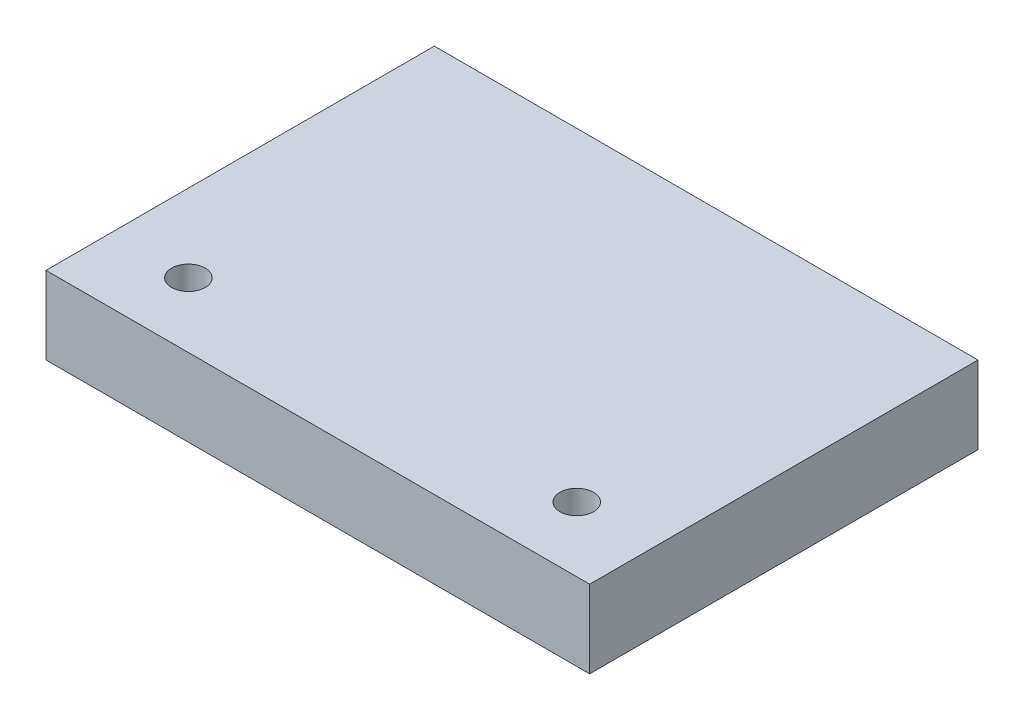
ISO-10303-21;
HEADER;
FILE_DESCRIPTION(('STEP AP214'),'2;1');
FILE_NAME('part.step','',(''),(''),'','','');
FILE_SCHEMA(('AUTOMOTIVE_DESIGN { 1 0 10303 214 1 1 1 1 }'));
ENDSEC;
DATA;
#1=APPLICATION_CONTEXT('core data for automotive mechanical design processes');
#2=APPLICATION_PROTOCOL_DEFINITION('international standard','automotive_design',2000,#1);
#3=PRODUCT_CONTEXT('',#1,'mechanical');
#4=PRODUCT('Part','Part','',(#3));
#5=PRODUCT_RELATED_PRODUCT_CATEGORY('part','',(#4));
#6=PRODUCT_DEFINITION_FORMATION('','',#4);
#7=PRODUCT_DEFINITION_CONTEXT('part definition',#1,'design');
#8=PRODUCT_DEFINITION('design','',#6,#7);
#9=PRODUCT_DEFINITION_SHAPE('','',#8);
#10=(LENGTH_UNIT() NAMED_UNIT(*) SI_UNIT(.MILLI.,.METRE.));
#11=(NAMED_UNIT(*) PLANE_ANGLE_UNIT() SI_UNIT($,.RADIAN.));
#12=(NAMED_UNIT(*) SI_UNIT($,.STERADIAN.) SOLID_ANGLE_UNIT());
#13=UNCERTAINTY_MEASURE_WITH_UNIT(LENGTH_MEASURE(1.E-05),#10,'distance_accuracy_value','');
#14=(GEOMETRIC_REPRESENTATION_CONTEXT(3) GLOBAL_UNCERTAINTY_ASSIGNED_CONTEXT((#13)) GLOBAL_UNIT_ASSIGNED_CONTEXT((#10,
#11,#12)) REPRESENTATION_CONTEXT('',''));
#15=CARTESIAN_POINT('',(0.,0.,0.));
#16=DIRECTION('',(0.,0.,1.));
#17=DIRECTION('',(1.,0.,0.));
#18=AXIS2_PLACEMENT_3D('',#15,#16,#17);
#19=CARTESIAN_POINT('',(10.5,3.,-7.5));
#20=DIRECTION('',(-1.,0.,0.));
#21=DIRECTION('',(0.,0.,1.));
#22=AXIS2_PLACEMENT_3D('',#19,#20,#21);
#23=PLANE('',#22);
#24=DIRECTION('',(0.,0.,-1.));
#25=VECTOR('',#24,1.);
#26=CARTESIAN_POINT('',(10.5,0.,-7.5));
#27=LINE('',#26,#25);
#28=CARTESIAN_POINT('',(10.5,0.,7.5));
#29=VERTEX_POINT('',#28);
#30=CARTESIAN_POINT('',(10.5,0.,-7.5));
#31=VERTEX_POINT('',#30);
#32=EDGE_CURVE('E102',#29,#31,#27,.T.);
#33=ORIENTED_EDGE('',*,*,#32,.T.);
#34=DIRECTION('',(0.,-1.,0.));
#35=VECTOR('',#34,1.);
#36=CARTESIAN_POINT('',(10.5,3.,-7.5));
#37=LINE('',#36,#35);
#38=CARTESIAN_POINT('',(10.5,3.,-7.5));
#39=VERTEX_POINT('',#38);
#40=EDGE_CURVE('E11',#39,#31,#37,.T.);
#41=ORIENTED_EDGE('',*,*,#40,.F.);
#42=DIRECTION('',(0.,0.,-1.));
#43=VECTOR('',#42,1.);
#44=CARTESIAN_POINT('',(10.5,3.,-7.5));
#45=LINE('',#44,#43);
#46=CARTESIAN_POINT('',(10.5,3.,7.5));
#47=VERTEX_POINT('',#46);
#48=EDGE_CURVE('E90',#47,#39,#45,.T.);
#49=ORIENTED_EDGE('',*,*,#48,.F.);
#50=DIRECTION('',(0.,-1.,0.));
#51=VECTOR('',#50,1.);
#52=CARTESIAN_POINT('',(10.5,3.,7.5));
#53=LINE('',#52,#51);
#54=EDGE_CURVE('E98',#47,#29,#53,.T.);
#55=ORIENTED_EDGE('',*,*,#54,.T.);
#56=EDGE_LOOP('',(#33,#41,#49,#55));
#57=FACE_BOUND('',#56,.T.);
#58=ADVANCED_FACE('F39',(#57),#23,.F.);
#59=CARTESIAN_POINT('',(-10.5,3.,-7.5));
#60=DIRECTION('',(0.,0.,1.));
#61=DIRECTION('',(1.,0.,0.));
#62=AXIS2_PLACEMENT_3D('',#59,#60,#61);
#63=PLANE('',#62);
#64=DIRECTION('',(-1.,0.,0.));
#65=VECTOR('',#64,1.);
#66=CARTESIAN_POINT('',(-10.5,0.,-7.5));
#67=LINE('',#66,#65);
#68=CARTESIAN_POINT('',(-10.5,0.,-7.5));
#69=VERTEX_POINT('',#68);
#70=EDGE_CURVE('E94',#31,#69,#67,.T.);
#71=ORIENTED_EDGE('',*,*,#70,.T.);
#72=DIRECTION('',(0.,-1.,0.));
#73=VECTOR('',#72,1.);
#74=CARTESIAN_POINT('',(-10.5,3.,-7.5));
#75=LINE('',#74,#73);
#76=CARTESIAN_POINT('',(-10.5,3.,-7.5));
#77=VERTEX_POINT('',#76);
#78=EDGE_CURVE('E47',#77,#69,#75,.T.);
#79=ORIENTED_EDGE('',*,*,#78,.F.);
#80=DIRECTION('',(-1.,0.,0.));
#81=VECTOR('',#80,1.);
#82=CARTESIAN_POINT('',(-10.5,3.,-7.5));
#83=LINE('',#82,#81);
#84=EDGE_CURVE('E85',#39,#77,#83,.T.);
#85=ORIENTED_EDGE('',*,*,#84,.F.);
#86=ORIENTED_EDGE('',*,*,#40,.T.);
#87=EDGE_LOOP('',(#71,#79,#85,#86));
#88=FACE_BOUND('',#87,.T.);
#89=ADVANCED_FACE('F93',(#88),#63,.F.);
#90=CARTESIAN_POINT('',(-10.5,3.,-7.5));
#91=DIRECTION('',(1.,0.,0.));
#92=DIRECTION('',(0.,0.,-1.));
#93=AXIS2_PLACEMENT_3D('',#90,#91,#92);
#94=PLANE('',#93);
#95=DIRECTION('',(0.,0.,1.));
#96=VECTOR('',#95,1.);
#97=CARTESIAN_POINT('',(-10.5,0.,-7.5));
#98=LINE('',#97,#96);
#99=CARTESIAN_POINT('',(-10.5,0.,7.5));
#100=VERTEX_POINT('',#99);
#101=EDGE_CURVE('E72',#69,#100,#98,.T.);
#102=ORIENTED_EDGE('',*,*,#101,.T.);
#103=DIRECTION('',(0.,-1.,0.));
#104=VECTOR('',#103,1.);
#105=CARTESIAN_POINT('',(-10.5,3.,7.5));
#106=LINE('',#105,#104);
#107=CARTESIAN_POINT('',(-10.5,3.,7.5));
#108=VERTEX_POINT('',#107);
#109=EDGE_CURVE('E95',#108,#100,#106,.T.);
#110=ORIENTED_EDGE('',*,*,#109,.F.);
#111=DIRECTION('',(0.,0.,1.));
#112=VECTOR('',#111,1.);
#113=CARTESIAN_POINT('',(-10.5,3.,-7.5));
#114=LINE('',#113,#112);
#115=EDGE_CURVE('E88',#77,#108,#114,.T.);
#116=ORIENTED_EDGE('',*,*,#115,.F.);
#117=ORIENTED_EDGE('',*,*,#78,.T.);
#118=EDGE_LOOP('',(#102,#110,#116,#117));
#119=FACE_BOUND('',#118,.T.);
#120=ADVANCED_FACE('F96',(#119),#94,.F.);
#121=CARTESIAN_POINT('',(-10.5,3.,7.5));
#122=DIRECTION('',(0.,0.,-1.));
#123=DIRECTION('',(-1.,0.,0.));
#124=AXIS2_PLACEMENT_3D('',#121,#122,#123);
#125=PLANE('',#124);
#126=DIRECTION('',(1.,0.,0.));
#127=VECTOR('',#126,1.);
#128=CARTESIAN_POINT('',(-10.5,0.,7.5));
#129=LINE('',#128,#127);
#130=EDGE_CURVE('E78',#100,#29,#129,.T.);
#131=ORIENTED_EDGE('',*,*,#130,.T.);
#132=ORIENTED_EDGE('',*,*,#54,.F.);
#133=DIRECTION('',(1.,0.,0.));
#134=VECTOR('',#133,1.);
#135=CARTESIAN_POINT('',(-10.5,3.,7.5));
#136=LINE('',#135,#134);
#137=EDGE_CURVE('E55',#108,#47,#136,.T.);
#138=ORIENTED_EDGE('',*,*,#137,.F.);
#139=ORIENTED_EDGE('',*,*,#109,.T.);
#140=EDGE_LOOP('',(#131,#132,#138,#139));
#141=FACE_BOUND('',#140,.T.);
#142=ADVANCED_FACE('F110',(#141),#125,.F.);
#143=CARTESIAN_POINT('',(0.,3.,0.));
#144=DIRECTION('',(0.,1.,0.));
#145=DIRECTION('',(0.,0.,1.));
#146=AXIS2_PLACEMENT_3D('',#143,#144,#145);
#147=PLANE('',#146);
#148=CARTESIAN_POINT('',(-7.5,3.,5.));
#149=DIRECTION('',(0.,1.,0.));
#150=DIRECTION('',(0.,0.,1.));
#151=AXIS2_PLACEMENT_3D('',#148,#149,#150);
#152=CIRCLE('',#151,0.650000000000013);
#153=CARTESIAN_POINT('',(-7.5,3.,5.65000000000001));
#154=VERTEX_POINT('',#153);
#155=EDGE_CURVE('E124',#154,#154,#152,.T.);
#156=ORIENTED_EDGE('',*,*,#155,.F.);
#157=EDGE_LOOP('',(#156));
#158=FACE_BOUND('',#157,.T.);
#159=CARTESIAN_POINT('',(7.5,3.,5.));
#160=DIRECTION('',(0.,1.,0.));
#161=DIRECTION('',(0.,0.,1.));
#162=AXIS2_PLACEMENT_3D('',#159,#160,#161);
#163=CIRCLE('',#162,0.650000000000013);
#164=CARTESIAN_POINT('',(7.5,3.,5.65000000000001));
#165=VERTEX_POINT('',#164);
#166=EDGE_CURVE('E118',#165,#165,#163,.T.);
#167=ORIENTED_EDGE('',*,*,#166,.F.);
#168=EDGE_LOOP('',(#167));
#169=FACE_BOUND('',#168,.T.);
#170=ORIENTED_EDGE('',*,*,#48,.T.);
#171=ORIENTED_EDGE('',*,*,#84,.T.);
#172=ORIENTED_EDGE('',*,*,#115,.T.);
#173=ORIENTED_EDGE('',*,*,#137,.T.);
#174=EDGE_LOOP('',(#170,#171,#172,#173));
#175=FACE_BOUND('',#174,.T.);
#176=ADVANCED_FACE('F86',(#158,#169,#175),#147,.T.);
#177=CARTESIAN_POINT('',(0.,0.,0.));
#178=DIRECTION('',(0.,1.,0.));
#179=DIRECTION('',(0.,0.,1.));
#180=AXIS2_PLACEMENT_3D('',#177,#178,#179);
#181=PLANE('',#180);
#182=CARTESIAN_POINT('',(-7.5,0.,5.));
#183=DIRECTION('',(0.,1.,0.));
#184=DIRECTION('',(0.,0.,1.));
#185=AXIS2_PLACEMENT_3D('',#182,#183,#184);
#186=CIRCLE('',#185,0.650000000000013);
#187=CARTESIAN_POINT('',(-7.5,0.,5.65000000000001));
#188=VERTEX_POINT('',#187);
#189=EDGE_CURVE('E121',#188,#188,#186,.T.);
#190=ORIENTED_EDGE('',*,*,#189,.T.);
#191=EDGE_LOOP('',(#190));
#192=FACE_BOUND('',#191,.T.);
#193=CARTESIAN_POINT('',(7.5,0.,5.));
#194=DIRECTION('',(0.,1.,0.));
#195=DIRECTION('',(0.,0.,1.));
#196=AXIS2_PLACEMENT_3D('',#193,#194,#195);
#197=CIRCLE('',#196,0.650000000000013);
#198=CARTESIAN_POINT('',(7.5,0.,5.65000000000001));
#199=VERTEX_POINT('',#198);
#200=EDGE_CURVE('E105',#199,#199,#197,.T.);
#201=ORIENTED_EDGE('',*,*,#200,.T.);
#202=EDGE_LOOP('',(#201));
#203=FACE_BOUND('',#202,.T.);
#204=ORIENTED_EDGE('',*,*,#32,.F.);
#205=ORIENTED_EDGE('',*,*,#130,.F.);
#206=ORIENTED_EDGE('',*,*,#101,.F.);
#207=ORIENTED_EDGE('',*,*,#70,.F.);
#208=EDGE_LOOP('',(#204,#205,#206,#207));
#209=FACE_BOUND('',#208,.T.);
#210=ADVANCED_FACE('F113',(#192,#203,#209),#181,.F.);
#211=CARTESIAN_POINT('',(7.5,3.,5.));
#212=DIRECTION('',(0.,1.,0.));
#213=DIRECTION('',(0.,0.,1.));
#214=AXIS2_PLACEMENT_3D('',#211,#212,#213);
#215=CYLINDRICAL_SURFACE('',#214,0.650000000000013);
#216=ORIENTED_EDGE('',*,*,#200,.F.);
#217=EDGE_LOOP('',(#216));
#218=FACE_BOUND('',#217,.T.);
#219=ORIENTED_EDGE('',*,*,#166,.T.);
#220=EDGE_LOOP('',(#219));
#221=FACE_BOUND('',#220,.T.);
#222=ADVANCED_FACE('F135',(#218,#221),#215,.F.);
#223=CARTESIAN_POINT('',(-7.5,3.,5.));
#224=DIRECTION('',(0.,1.,0.));
#225=DIRECTION('',(0.,0.,1.));
#226=AXIS2_PLACEMENT_3D('',#223,#224,#225);
#227=CYLINDRICAL_SURFACE('',#226,0.650000000000013);
#228=ORIENTED_EDGE('',*,*,#189,.F.);
#229=EDGE_LOOP('',(#228));
#230=FACE_BOUND('',#229,.T.);
#231=ORIENTED_EDGE('',*,*,#155,.T.);
#232=EDGE_LOOP('',(#231));
#233=FACE_BOUND('',#232,.T.);
#234=ADVANCED_FACE('F128',(#230,#233),#227,.F.);
#235=CLOSED_SHELL('',(#58,#89,#120,#142,#176,#210,#222,#234));
#236=MANIFOLD_SOLID_BREP('B2',#235);
#237=ADVANCED_BREP_SHAPE_REPRESENTATION('',(#18,#236),#14);
#238=SHAPE_DEFINITION_REPRESENTATION(#9,#237);
ENDSEC;
END-ISO-10303-21;
